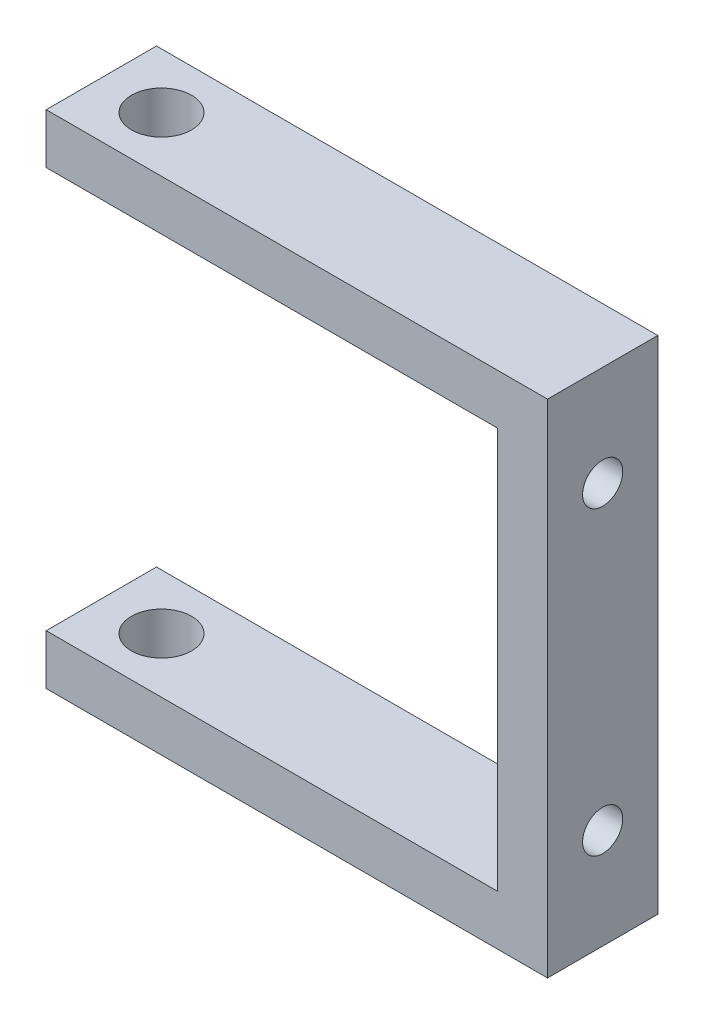
ISO-10303-21;
HEADER;
FILE_DESCRIPTION(('STEP AP214'),'2;1');
FILE_NAME('part.step','',(''),(''),'','','');
FILE_SCHEMA(('AUTOMOTIVE_DESIGN { 1 0 10303 214 1 1 1 1 }'));
ENDSEC;
DATA;
#1=APPLICATION_CONTEXT('core data for automotive mechanical design processes');
#2=APPLICATION_PROTOCOL_DEFINITION('international standard','automotive_design',2000,#1);
#3=PRODUCT_CONTEXT('',#1,'mechanical');
#4=PRODUCT('Part','Part','',(#3));
#5=PRODUCT_RELATED_PRODUCT_CATEGORY('part','',(#4));
#6=PRODUCT_DEFINITION_FORMATION('','',#4);
#7=PRODUCT_DEFINITION_CONTEXT('part definition',#1,'design');
#8=PRODUCT_DEFINITION('design','',#6,#7);
#9=PRODUCT_DEFINITION_SHAPE('','',#8);
#10=(LENGTH_UNIT() NAMED_UNIT(*) SI_UNIT(.MILLI.,.METRE.));
#11=(NAMED_UNIT(*) PLANE_ANGLE_UNIT() SI_UNIT($,.RADIAN.));
#12=(NAMED_UNIT(*) SI_UNIT($,.STERADIAN.) SOLID_ANGLE_UNIT());
#13=UNCERTAINTY_MEASURE_WITH_UNIT(LENGTH_MEASURE(1.E-05),#10,'distance_accuracy_value','');
#14=(GEOMETRIC_REPRESENTATION_CONTEXT(3) GLOBAL_UNCERTAINTY_ASSIGNED_CONTEXT((#13)) GLOBAL_UNIT_ASSIGNED_CONTEXT((#10,
#11,#12)) REPRESENTATION_CONTEXT('',''));
#15=CARTESIAN_POINT('',(0.,0.,0.));
#16=DIRECTION('',(0.,0.,1.));
#17=DIRECTION('',(1.,0.,0.));
#18=AXIS2_PLACEMENT_3D('',#15,#16,#17);
#19=CARTESIAN_POINT('',(0.,45.,11.));
#20=DIRECTION('',(1.,0.,0.));
#21=DIRECTION('',(0.,0.,-1.));
#22=AXIS2_PLACEMENT_3D('',#19,#20,#21);
#23=PLANE('',#22);
#24=DIRECTION('',(0.,-1.,0.));
#25=VECTOR('',#24,1.);
#26=CARTESIAN_POINT('',(0.,45.,0.));
#27=LINE('',#26,#25);
#28=CARTESIAN_POINT('',(0.,50.,0.));
#29=VERTEX_POINT('',#28);
#30=CARTESIAN_POINT('',(0.,45.,0.));
#31=VERTEX_POINT('',#30);
#32=EDGE_CURVE('E137',#29,#31,#27,.T.);
#33=ORIENTED_EDGE('',*,*,#32,.T.);
#34=DIRECTION('',(0.,0.,-1.));
#35=VECTOR('',#34,1.);
#36=CARTESIAN_POINT('',(0.,45.,11.));
#37=LINE('',#36,#35);
#38=CARTESIAN_POINT('',(0.,45.,11.));
#39=VERTEX_POINT('',#38);
#40=EDGE_CURVE('E11',#39,#31,#37,.T.);
#41=ORIENTED_EDGE('',*,*,#40,.F.);
#42=DIRECTION('',(0.,-1.,0.));
#43=VECTOR('',#42,1.);
#44=CARTESIAN_POINT('',(0.,45.,11.));
#45=LINE('',#44,#43);
#46=CARTESIAN_POINT('',(0.,50.,11.));
#47=VERTEX_POINT('',#46);
#48=EDGE_CURVE('E155',#47,#39,#45,.T.);
#49=ORIENTED_EDGE('',*,*,#48,.F.);
#50=DIRECTION('',(0.,0.,-1.));
#51=VECTOR('',#50,1.);
#52=CARTESIAN_POINT('',(0.,50.,11.));
#53=LINE('',#52,#51);
#54=EDGE_CURVE('E134',#47,#29,#53,.T.);
#55=ORIENTED_EDGE('',*,*,#54,.T.);
#56=EDGE_LOOP('',(#33,#41,#49,#55));
#57=FACE_BOUND('',#56,.T.);
#58=ADVANCED_FACE('F39',(#57),#23,.F.);
#59=CARTESIAN_POINT('',(45.,45.,11.));
#60=DIRECTION('',(0.,1.,0.));
#61=DIRECTION('',(0.,0.,1.));
#62=AXIS2_PLACEMENT_3D('',#59,#60,#61);
#63=PLANE('',#62);
#64=CARTESIAN_POINT('',(6.,45.,5.5));
#65=DIRECTION('',(0.,1.,0.));
#66=DIRECTION('',(0.,0.,1.));
#67=AXIS2_PLACEMENT_3D('',#64,#65,#66);
#68=CIRCLE('',#67,3.);
#69=CARTESIAN_POINT('',(6.,45.,8.5));
#70=VERTEX_POINT('',#69);
#71=EDGE_CURVE('E143',#70,#70,#68,.T.);
#72=ORIENTED_EDGE('',*,*,#71,.T.);
#73=EDGE_LOOP('',(#72));
#74=FACE_BOUND('',#73,.T.);
#75=DIRECTION('',(1.,0.,0.));
#76=VECTOR('',#75,1.);
#77=CARTESIAN_POINT('',(45.,45.,0.));
#78=LINE('',#77,#76);
#79=CARTESIAN_POINT('',(45.,45.,0.));
#80=VERTEX_POINT('',#79);
#81=EDGE_CURVE('E140',#31,#80,#78,.T.);
#82=ORIENTED_EDGE('',*,*,#81,.T.);
#83=DIRECTION('',(0.,0.,-1.));
#84=VECTOR('',#83,1.);
#85=CARTESIAN_POINT('',(45.,45.,11.));
#86=LINE('',#85,#84);
#87=CARTESIAN_POINT('',(45.,45.,11.));
#88=VERTEX_POINT('',#87);
#89=EDGE_CURVE('E48',#88,#80,#86,.T.);
#90=ORIENTED_EDGE('',*,*,#89,.F.);
#91=DIRECTION('',(1.,0.,0.));
#92=VECTOR('',#91,1.);
#93=CARTESIAN_POINT('',(45.,45.,11.));
#94=LINE('',#93,#92);
#95=EDGE_CURVE('E99',#39,#88,#94,.T.);
#96=ORIENTED_EDGE('',*,*,#95,.F.);
#97=ORIENTED_EDGE('',*,*,#40,.T.);
#98=EDGE_LOOP('',(#82,#90,#96,#97));
#99=FACE_BOUND('',#98,.T.);
#100=ADVANCED_FACE('F227',(#74,#99),#63,.F.);
#101=CARTESIAN_POINT('',(45.,5.,11.));
#102=DIRECTION('',(1.,0.,0.));
#103=DIRECTION('',(0.,0.,-1.));
#104=AXIS2_PLACEMENT_3D('',#101,#102,#103);
#105=PLANE('',#104);
#106=CARTESIAN_POINT('',(45.,40.,5.5));
#107=DIRECTION('',(-1.,0.,0.));
#108=DIRECTION('',(0.,0.,1.));
#109=AXIS2_PLACEMENT_3D('',#106,#107,#108);
#110=CIRCLE('',#109,2.);
#111=CARTESIAN_POINT('',(45.,40.,7.5));
#112=VERTEX_POINT('',#111);
#113=EDGE_CURVE('E164',#112,#112,#110,.T.);
#114=ORIENTED_EDGE('',*,*,#113,.F.);
#115=EDGE_LOOP('',(#114));
#116=FACE_BOUND('',#115,.T.);
#117=CARTESIAN_POINT('',(45.,10.,5.5));
#118=DIRECTION('',(-1.,0.,0.));
#119=DIRECTION('',(0.,0.,1.));
#120=AXIS2_PLACEMENT_3D('',#117,#118,#119);
#121=CIRCLE('',#120,2.);
#122=CARTESIAN_POINT('',(45.,10.,7.50000000000001));
#123=VERTEX_POINT('',#122);
#124=EDGE_CURVE('E172',#123,#123,#121,.T.);
#125=ORIENTED_EDGE('',*,*,#124,.F.);
#126=EDGE_LOOP('',(#125));
#127=FACE_BOUND('',#126,.T.);
#128=DIRECTION('',(0.,-1.,0.));
#129=VECTOR('',#128,1.);
#130=CARTESIAN_POINT('',(45.,5.,0.));
#131=LINE('',#130,#129);
#132=CARTESIAN_POINT('',(45.,5.,0.));
#133=VERTEX_POINT('',#132);
#134=EDGE_CURVE('E141',#80,#133,#131,.T.);
#135=ORIENTED_EDGE('',*,*,#134,.T.);
#136=DIRECTION('',(0.,0.,-1.));
#137=VECTOR('',#136,1.);
#138=CARTESIAN_POINT('',(45.,5.,11.));
#139=LINE('',#138,#137);
#140=CARTESIAN_POINT('',(45.,5.,11.));
#141=VERTEX_POINT('',#140);
#142=EDGE_CURVE('E157',#141,#133,#139,.T.);
#143=ORIENTED_EDGE('',*,*,#142,.F.);
#144=DIRECTION('',(0.,-1.,0.));
#145=VECTOR('',#144,1.);
#146=CARTESIAN_POINT('',(45.,5.,11.));
#147=LINE('',#146,#145);
#148=EDGE_CURVE('E188',#88,#141,#147,.T.);
#149=ORIENTED_EDGE('',*,*,#148,.F.);
#150=ORIENTED_EDGE('',*,*,#89,.T.);
#151=EDGE_LOOP('',(#135,#143,#149,#150));
#152=FACE_BOUND('',#151,.T.);
#153=ADVANCED_FACE('F231',(#116,#127,#152),#105,.F.);
#154=CARTESIAN_POINT('',(0.,5.,11.));
#155=DIRECTION('',(0.,-1.,0.));
#156=DIRECTION('',(0.,0.,-1.));
#157=AXIS2_PLACEMENT_3D('',#154,#155,#156);
#158=PLANE('',#157);
#159=CARTESIAN_POINT('',(6.,5.,5.5));
#160=DIRECTION('',(0.,-1.,0.));
#161=DIRECTION('',(0.,0.,-1.));
#162=AXIS2_PLACEMENT_3D('',#159,#160,#161);
#163=CIRCLE('',#162,3.);
#164=CARTESIAN_POINT('',(6.,5.,2.5));
#165=VERTEX_POINT('',#164);
#166=EDGE_CURVE('E181',#165,#165,#163,.T.);
#167=ORIENTED_EDGE('',*,*,#166,.T.);
#168=EDGE_LOOP('',(#167));
#169=FACE_BOUND('',#168,.T.);
#170=DIRECTION('',(-1.,0.,0.));
#171=VECTOR('',#170,1.);
#172=CARTESIAN_POINT('',(0.,5.,0.));
#173=LINE('',#172,#171);
#174=CARTESIAN_POINT('',(0.,5.,0.));
#175=VERTEX_POINT('',#174);
#176=EDGE_CURVE('E144',#133,#175,#173,.T.);
#177=ORIENTED_EDGE('',*,*,#176,.T.);
#178=DIRECTION('',(0.,0.,-1.));
#179=VECTOR('',#178,1.);
#180=CARTESIAN_POINT('',(0.,5.,11.));
#181=LINE('',#180,#179);
#182=CARTESIAN_POINT('',(0.,5.,11.));
#183=VERTEX_POINT('',#182);
#184=EDGE_CURVE('E156',#183,#175,#181,.T.);
#185=ORIENTED_EDGE('',*,*,#184,.F.);
#186=DIRECTION('',(-1.,0.,0.));
#187=VECTOR('',#186,1.);
#188=CARTESIAN_POINT('',(0.,5.,11.));
#189=LINE('',#188,#187);
#190=EDGE_CURVE('E192',#141,#183,#189,.T.);
#191=ORIENTED_EDGE('',*,*,#190,.F.);
#192=ORIENTED_EDGE('',*,*,#142,.T.);
#193=EDGE_LOOP('',(#177,#185,#191,#192));
#194=FACE_BOUND('',#193,.T.);
#195=ADVANCED_FACE('F196',(#169,#194),#158,.F.);
#196=CARTESIAN_POINT('',(0.,0.,11.));
#197=DIRECTION('',(1.,0.,0.));
#198=DIRECTION('',(0.,0.,-1.));
#199=AXIS2_PLACEMENT_3D('',#196,#197,#198);
#200=PLANE('',#199);
#201=DIRECTION('',(0.,-1.,0.));
#202=VECTOR('',#201,1.);
#203=CARTESIAN_POINT('',(0.,0.,0.));
#204=LINE('',#203,#202);
#205=CARTESIAN_POINT('',(0.,0.,0.));
#206=VERTEX_POINT('',#205);
#207=EDGE_CURVE('E150',#175,#206,#204,.T.);
#208=ORIENTED_EDGE('',*,*,#207,.T.);
#209=DIRECTION('',(0.,0.,-1.));
#210=VECTOR('',#209,1.);
#211=CARTESIAN_POINT('',(0.,0.,11.));
#212=LINE('',#211,#210);
#213=CARTESIAN_POINT('',(0.,0.,11.));
#214=VERTEX_POINT('',#213);
#215=EDGE_CURVE('E126',#214,#206,#212,.T.);
#216=ORIENTED_EDGE('',*,*,#215,.F.);
#217=DIRECTION('',(0.,-1.,0.));
#218=VECTOR('',#217,1.);
#219=CARTESIAN_POINT('',(0.,0.,11.));
#220=LINE('',#219,#218);
#221=EDGE_CURVE('E116',#183,#214,#220,.T.);
#222=ORIENTED_EDGE('',*,*,#221,.F.);
#223=ORIENTED_EDGE('',*,*,#184,.T.);
#224=EDGE_LOOP('',(#208,#216,#222,#223));
#225=FACE_BOUND('',#224,.T.);
#226=ADVANCED_FACE('F205',(#225),#200,.F.);
#227=CARTESIAN_POINT('',(50.,0.,11.));
#228=DIRECTION('',(0.,1.,0.));
#229=DIRECTION('',(-1.,0.,0.));
#230=AXIS2_PLACEMENT_3D('',#227,#228,#229);
#231=PLANE('',#230);
#232=CARTESIAN_POINT('',(6.,0.,5.5));
#233=DIRECTION('',(0.,1.,0.));
#234=DIRECTION('',(-1.,0.,0.));
#235=AXIS2_PLACEMENT_3D('',#232,#233,#234);
#236=CIRCLE('',#235,3.);
#237=CARTESIAN_POINT('',(3.,0.,5.5));
#238=VERTEX_POINT('',#237);
#239=EDGE_CURVE('E180',#238,#238,#236,.T.);
#240=ORIENTED_EDGE('',*,*,#239,.T.);
#241=EDGE_LOOP('',(#240));
#242=FACE_BOUND('',#241,.T.);
#243=DIRECTION('',(1.,0.,0.));
#244=VECTOR('',#243,1.);
#245=CARTESIAN_POINT('',(50.,0.,0.));
#246=LINE('',#245,#244);
#247=CARTESIAN_POINT('',(50.,0.,0.));
#248=VERTEX_POINT('',#247);
#249=EDGE_CURVE('E130',#206,#248,#246,.T.);
#250=ORIENTED_EDGE('',*,*,#249,.T.);
#251=DIRECTION('',(0.,0.,-1.));
#252=VECTOR('',#251,1.);
#253=CARTESIAN_POINT('',(50.,0.,11.));
#254=LINE('',#253,#252);
#255=CARTESIAN_POINT('',(50.,0.,11.));
#256=VERTEX_POINT('',#255);
#257=EDGE_CURVE('E123',#256,#248,#254,.T.);
#258=ORIENTED_EDGE('',*,*,#257,.F.);
#259=DIRECTION('',(1.,0.,0.));
#260=VECTOR('',#259,1.);
#261=CARTESIAN_POINT('',(50.,0.,11.));
#262=LINE('',#261,#260);
#263=EDGE_CURVE('E114',#214,#256,#262,.T.);
#264=ORIENTED_EDGE('',*,*,#263,.F.);
#265=ORIENTED_EDGE('',*,*,#215,.T.);
#266=EDGE_LOOP('',(#250,#258,#264,#265));
#267=FACE_BOUND('',#266,.T.);
#268=ADVANCED_FACE('F125',(#242,#267),#231,.F.);
#269=CARTESIAN_POINT('',(50.,50.,11.));
#270=DIRECTION('',(-1.,0.,0.));
#271=DIRECTION('',(0.,-1.,0.));
#272=AXIS2_PLACEMENT_3D('',#269,#270,#271);
#273=PLANE('',#272);
#274=CARTESIAN_POINT('',(50.,40.,5.5));
#275=DIRECTION('',(-1.,0.,0.));
#276=DIRECTION('',(0.,-1.,0.));
#277=AXIS2_PLACEMENT_3D('',#274,#275,#276);
#278=CIRCLE('',#277,2.);
#279=CARTESIAN_POINT('',(50.,38.,5.5));
#280=VERTEX_POINT('',#279);
#281=EDGE_CURVE('E45',#280,#280,#278,.T.);
#282=ORIENTED_EDGE('',*,*,#281,.T.);
#283=EDGE_LOOP('',(#282));
#284=FACE_BOUND('',#283,.T.);
#285=CARTESIAN_POINT('',(50.,10.,5.5));
#286=DIRECTION('',(-1.,0.,0.));
#287=DIRECTION('',(0.,-1.,0.));
#288=AXIS2_PLACEMENT_3D('',#285,#286,#287);
#289=CIRCLE('',#288,2.);
#290=CARTESIAN_POINT('',(50.,8.,5.5));
#291=VERTEX_POINT('',#290);
#292=EDGE_CURVE('E162',#291,#291,#289,.T.);
#293=ORIENTED_EDGE('',*,*,#292,.T.);
#294=EDGE_LOOP('',(#293));
#295=FACE_BOUND('',#294,.T.);
#296=DIRECTION('',(0.,1.,0.));
#297=VECTOR('',#296,1.);
#298=CARTESIAN_POINT('',(50.,50.,0.));
#299=LINE('',#298,#297);
#300=CARTESIAN_POINT('',(50.,50.,0.));
#301=VERTEX_POINT('',#300);
#302=EDGE_CURVE('E88',#248,#301,#299,.T.);
#303=ORIENTED_EDGE('',*,*,#302,.T.);
#304=DIRECTION('',(0.,0.,-1.));
#305=VECTOR('',#304,1.);
#306=CARTESIAN_POINT('',(50.,50.,11.));
#307=LINE('',#306,#305);
#308=CARTESIAN_POINT('',(50.,50.,11.));
#309=VERTEX_POINT('',#308);
#310=EDGE_CURVE('E129',#309,#301,#307,.T.);
#311=ORIENTED_EDGE('',*,*,#310,.F.);
#312=DIRECTION('',(0.,1.,0.));
#313=VECTOR('',#312,1.);
#314=CARTESIAN_POINT('',(50.,50.,11.));
#315=LINE('',#314,#313);
#316=EDGE_CURVE('E120',#256,#309,#315,.T.);
#317=ORIENTED_EDGE('',*,*,#316,.F.);
#318=ORIENTED_EDGE('',*,*,#257,.T.);
#319=EDGE_LOOP('',(#303,#311,#317,#318));
#320=FACE_BOUND('',#319,.T.);
#321=ADVANCED_FACE('F132',(#284,#295,#320),#273,.F.);
#322=CARTESIAN_POINT('',(0.,50.,11.));
#323=DIRECTION('',(0.,-1.,0.));
#324=DIRECTION('',(0.,0.,-1.));
#325=AXIS2_PLACEMENT_3D('',#322,#323,#324);
#326=PLANE('',#325);
#327=CARTESIAN_POINT('',(6.,50.,5.5));
#328=DIRECTION('',(0.,1.,0.));
#329=DIRECTION('',(0.,0.,1.));
#330=AXIS2_PLACEMENT_3D('',#327,#328,#329);
#331=CIRCLE('',#330,3.);
#332=CARTESIAN_POINT('',(6.,50.,8.5));
#333=VERTEX_POINT('',#332);
#334=EDGE_CURVE('E166',#333,#333,#331,.T.);
#335=ORIENTED_EDGE('',*,*,#334,.F.);
#336=EDGE_LOOP('',(#335));
#337=FACE_BOUND('',#336,.T.);
#338=DIRECTION('',(-1.,0.,0.));
#339=VECTOR('',#338,1.);
#340=CARTESIAN_POINT('',(0.,50.,0.));
#341=LINE('',#340,#339);
#342=EDGE_CURVE('E95',#301,#29,#341,.T.);
#343=ORIENTED_EDGE('',*,*,#342,.T.);
#344=ORIENTED_EDGE('',*,*,#54,.F.);
#345=DIRECTION('',(-1.,0.,0.));
#346=VECTOR('',#345,1.);
#347=CARTESIAN_POINT('',(0.,50.,11.));
#348=LINE('',#347,#346);
#349=EDGE_CURVE('E60',#309,#47,#348,.T.);
#350=ORIENTED_EDGE('',*,*,#349,.F.);
#351=ORIENTED_EDGE('',*,*,#310,.T.);
#352=EDGE_LOOP('',(#343,#344,#350,#351));
#353=FACE_BOUND('',#352,.T.);
#354=ADVANCED_FACE('F209',(#337,#353),#326,.F.);
#355=CARTESIAN_POINT('',(0.,0.,11.));
#356=DIRECTION('',(0.,0.,-1.));
#357=DIRECTION('',(-1.,0.,0.));
#358=AXIS2_PLACEMENT_3D('',#355,#356,#357);
#359=PLANE('',#358);
#360=ORIENTED_EDGE('',*,*,#48,.T.);
#361=ORIENTED_EDGE('',*,*,#95,.T.);
#362=ORIENTED_EDGE('',*,*,#148,.T.);
#363=ORIENTED_EDGE('',*,*,#190,.T.);
#364=ORIENTED_EDGE('',*,*,#221,.T.);
#365=ORIENTED_EDGE('',*,*,#263,.T.);
#366=ORIENTED_EDGE('',*,*,#316,.T.);
#367=ORIENTED_EDGE('',*,*,#349,.T.);
#368=EDGE_LOOP('',(#360,#361,#362,#363,#364,#365,#366,#367));
#369=FACE_BOUND('',#368,.T.);
#370=ADVANCED_FACE('F113',(#369),#359,.F.);
#371=CARTESIAN_POINT('',(0.,0.,0.));
#372=DIRECTION('',(0.,0.,-1.));
#373=DIRECTION('',(-1.,0.,0.));
#374=AXIS2_PLACEMENT_3D('',#371,#372,#373);
#375=PLANE('',#374);
#376=ORIENTED_EDGE('',*,*,#32,.F.);
#377=ORIENTED_EDGE('',*,*,#342,.F.);
#378=ORIENTED_EDGE('',*,*,#302,.F.);
#379=ORIENTED_EDGE('',*,*,#249,.F.);
#380=ORIENTED_EDGE('',*,*,#207,.F.);
#381=ORIENTED_EDGE('',*,*,#176,.F.);
#382=ORIENTED_EDGE('',*,*,#134,.F.);
#383=ORIENTED_EDGE('',*,*,#81,.F.);
#384=EDGE_LOOP('',(#376,#377,#378,#379,#380,#381,#382,#383));
#385=FACE_BOUND('',#384,.T.);
#386=ADVANCED_FACE('F202',(#385),#375,.T.);
#387=CARTESIAN_POINT('',(6.,-9.99999999999999,5.5));
#388=DIRECTION('',(0.,1.,0.));
#389=DIRECTION('',(0.,0.,1.));
#390=AXIS2_PLACEMENT_3D('',#387,#388,#389);
#391=CYLINDRICAL_SURFACE('',#390,3.);
#392=ORIENTED_EDGE('',*,*,#334,.T.);
#393=EDGE_LOOP('',(#392));
#394=FACE_BOUND('',#393,.T.);
#395=ORIENTED_EDGE('',*,*,#71,.F.);
#396=EDGE_LOOP('',(#395));
#397=FACE_BOUND('',#396,.T.);
#398=ADVANCED_FACE('F251',(#394,#397),#391,.F.);
#399=ORIENTED_EDGE('',*,*,#239,.F.);
#400=EDGE_LOOP('',(#399));
#401=FACE_BOUND('',#400,.T.);
#402=ORIENTED_EDGE('',*,*,#166,.F.);
#403=EDGE_LOOP('',(#402));
#404=FACE_BOUND('',#403,.T.);
#405=ADVANCED_FACE('F248',(#401,#404),#391,.F.);
#406=CARTESIAN_POINT('',(56.,10.,5.5));
#407=DIRECTION('',(-1.,0.,0.));
#408=DIRECTION('',(0.,0.,1.));
#409=AXIS2_PLACEMENT_3D('',#406,#407,#408);
#410=CYLINDRICAL_SURFACE('',#409,2.);
#411=ORIENTED_EDGE('',*,*,#124,.T.);
#412=EDGE_LOOP('',(#411));
#413=FACE_BOUND('',#412,.T.);
#414=ORIENTED_EDGE('',*,*,#292,.F.);
#415=EDGE_LOOP('',(#414));
#416=FACE_BOUND('',#415,.T.);
#417=ADVANCED_FACE('F252',(#413,#416),#410,.F.);
#418=CARTESIAN_POINT('',(56.,40.,5.5));
#419=DIRECTION('',(-1.,0.,0.));
#420=DIRECTION('',(0.,0.,1.));
#421=AXIS2_PLACEMENT_3D('',#418,#419,#420);
#422=CYLINDRICAL_SURFACE('',#421,2.);
#423=ORIENTED_EDGE('',*,*,#113,.T.);
#424=EDGE_LOOP('',(#423));
#425=FACE_BOUND('',#424,.T.);
#426=ORIENTED_EDGE('',*,*,#281,.F.);
#427=EDGE_LOOP('',(#426));
#428=FACE_BOUND('',#427,.T.);
#429=ADVANCED_FACE('F259',(#425,#428),#422,.F.);
#430=CLOSED_SHELL('',(#58,#100,#153,#195,#226,#268,#321,#354,#370,#386,#398,#405,#417,#429));
#431=MANIFOLD_SOLID_BREP('B2',#430);
#432=ADVANCED_BREP_SHAPE_REPRESENTATION('',(#18,#431),#14);
#433=SHAPE_DEFINITION_REPRESENTATION(#9,#432);
ENDSEC;
END-ISO-10303-21;
